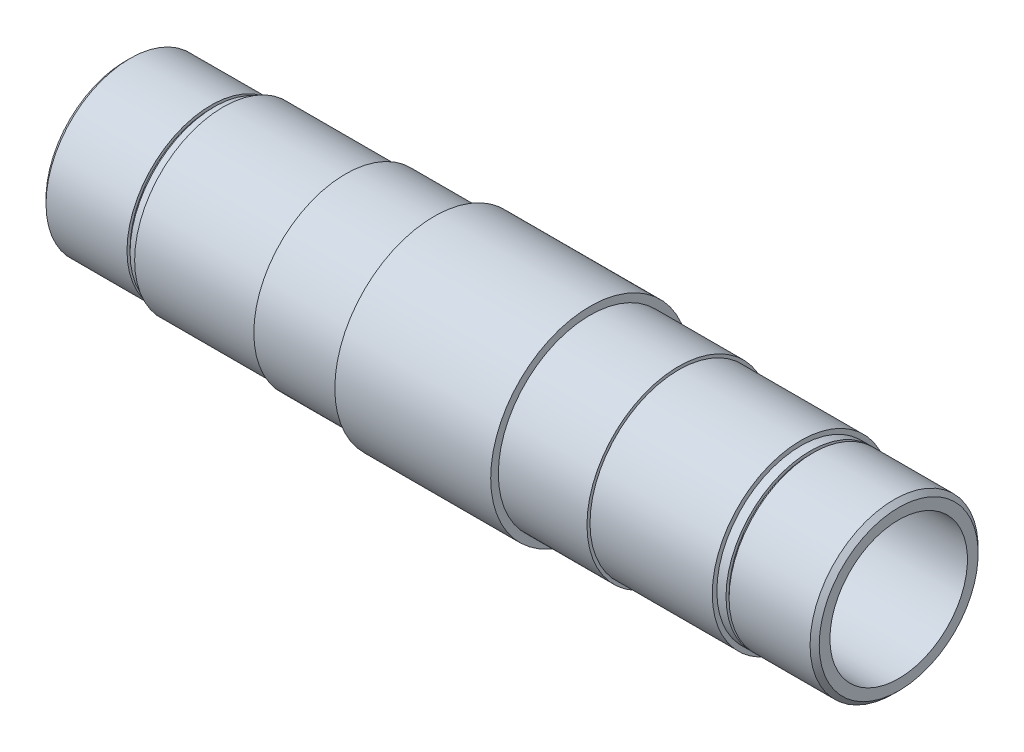
ISO-10303-21;
HEADER;
FILE_DESCRIPTION(('STEP AP214'),'2;1');
FILE_NAME('part.step','',(''),(''),'','','');
FILE_SCHEMA(('AUTOMOTIVE_DESIGN { 1 0 10303 214 1 1 1 1 }'));
ENDSEC;
DATA;
#1=APPLICATION_CONTEXT('core data for automotive mechanical design processes');
#2=APPLICATION_PROTOCOL_DEFINITION('international standard','automotive_design',2000,#1);
#3=PRODUCT_CONTEXT('',#1,'mechanical');
#4=PRODUCT('Part','Part','',(#3));
#5=PRODUCT_RELATED_PRODUCT_CATEGORY('part','',(#4));
#6=PRODUCT_DEFINITION_FORMATION('','',#4);
#7=PRODUCT_DEFINITION_CONTEXT('part definition',#1,'design');
#8=PRODUCT_DEFINITION('design','',#6,#7);
#9=PRODUCT_DEFINITION_SHAPE('','',#8);
#10=(LENGTH_UNIT() NAMED_UNIT(*) SI_UNIT(.MILLI.,.METRE.));
#11=(NAMED_UNIT(*) PLANE_ANGLE_UNIT() SI_UNIT($,.RADIAN.));
#12=(NAMED_UNIT(*) SI_UNIT($,.STERADIAN.) SOLID_ANGLE_UNIT());
#13=UNCERTAINTY_MEASURE_WITH_UNIT(LENGTH_MEASURE(1.E-05),#10,'distance_accuracy_value','');
#14=(GEOMETRIC_REPRESENTATION_CONTEXT(3) GLOBAL_UNCERTAINTY_ASSIGNED_CONTEXT((#13)) GLOBAL_UNIT_ASSIGNED_CONTEXT((#10,
#11,#12)) REPRESENTATION_CONTEXT('',''));
#15=CARTESIAN_POINT('',(0.,0.,0.));
#16=DIRECTION('',(0.,0.,1.));
#17=DIRECTION('',(1.,0.,0.));
#18=AXIS2_PLACEMENT_3D('',#15,#16,#17);
#19=CARTESIAN_POINT('',(0.,0.,0.));
#20=DIRECTION('',(-1.,0.,0.));
#21=DIRECTION('',(0.,0.,1.));
#22=AXIS2_PLACEMENT_3D('',#19,#20,#21);
#23=CYLINDRICAL_SURFACE('',#22,27.5);
#24=CARTESIAN_POINT('',(-97.5,0.,0.));
#25=DIRECTION('',(-1.,0.,0.));
#26=DIRECTION('',(0.,0.,1.));
#27=AXIS2_PLACEMENT_3D('',#24,#25,#26);
#28=CIRCLE('',#27,27.5);
#29=CARTESIAN_POINT('',(-97.5,0.,27.5));
#30=VERTEX_POINT('',#29);
#31=EDGE_CURVE('E94',#30,#30,#28,.T.);
#32=ORIENTED_EDGE('',*,*,#31,.F.);
#33=EDGE_LOOP('',(#32));
#34=FACE_BOUND('',#33,.T.);
#35=CARTESIAN_POINT('',(-94.5,0.,0.));
#36=DIRECTION('',(-1.,0.,0.));
#37=DIRECTION('',(0.,0.,1.));
#38=AXIS2_PLACEMENT_3D('',#35,#36,#37);
#39=CIRCLE('',#38,27.5);
#40=CARTESIAN_POINT('',(-94.5,0.,27.5));
#41=VERTEX_POINT('',#40);
#42=EDGE_CURVE('E64',#41,#41,#39,.T.);
#43=ORIENTED_EDGE('',*,*,#42,.T.);
#44=EDGE_LOOP('',(#43));
#45=FACE_BOUND('',#44,.T.);
#46=ADVANCED_FACE('F44',(#34,#45),#23,.T.);
#47=CARTESIAN_POINT('',(-94.5,29.,0.));
#48=DIRECTION('',(1.,0.,0.));
#49=DIRECTION('',(0.,0.,-1.));
#50=AXIS2_PLACEMENT_3D('',#47,#48,#49);
#51=PLANE('',#50);
#52=ORIENTED_EDGE('',*,*,#42,.F.);
#53=EDGE_LOOP('',(#52));
#54=FACE_BOUND('',#53,.T.);
#55=CARTESIAN_POINT('',(-94.5,0.,0.));
#56=DIRECTION('',(-1.,0.,0.));
#57=DIRECTION('',(0.,0.,1.));
#58=AXIS2_PLACEMENT_3D('',#55,#56,#57);
#59=CIRCLE('',#58,29.);
#60=CARTESIAN_POINT('',(-94.5,0.,29.));
#61=VERTEX_POINT('',#60);
#62=EDGE_CURVE('E67',#61,#61,#59,.T.);
#63=ORIENTED_EDGE('',*,*,#62,.T.);
#64=EDGE_LOOP('',(#63));
#65=FACE_BOUND('',#64,.T.);
#66=ADVANCED_FACE('F148',(#54,#65),#51,.F.);
#67=CARTESIAN_POINT('',(0.,0.,0.));
#68=DIRECTION('',(-1.,0.,0.));
#69=DIRECTION('',(0.,0.,1.));
#70=AXIS2_PLACEMENT_3D('',#67,#68,#69);
#71=CYLINDRICAL_SURFACE('',#70,29.);
#72=ORIENTED_EDGE('',*,*,#62,.F.);
#73=EDGE_LOOP('',(#72));
#74=FACE_BOUND('',#73,.T.);
#75=CARTESIAN_POINT('',(-54.5,0.,0.));
#76=DIRECTION('',(-1.,0.,0.));
#77=DIRECTION('',(0.,0.,1.));
#78=AXIS2_PLACEMENT_3D('',#75,#76,#77);
#79=CIRCLE('',#78,29.);
#80=CARTESIAN_POINT('',(-54.5,0.,29.));
#81=VERTEX_POINT('',#80);
#82=EDGE_CURVE('E70',#81,#81,#79,.T.);
#83=ORIENTED_EDGE('',*,*,#82,.T.);
#84=EDGE_LOOP('',(#83));
#85=FACE_BOUND('',#84,.T.);
#86=ADVANCED_FACE('F154',(#74,#85),#71,.T.);
#87=CARTESIAN_POINT('',(-54.5,30.,0.));
#88=DIRECTION('',(1.,0.,0.));
#89=DIRECTION('',(0.,0.,-1.));
#90=AXIS2_PLACEMENT_3D('',#87,#88,#89);
#91=PLANE('',#90);
#92=ORIENTED_EDGE('',*,*,#82,.F.);
#93=EDGE_LOOP('',(#92));
#94=FACE_BOUND('',#93,.T.);
#95=CARTESIAN_POINT('',(-54.5,0.,0.));
#96=DIRECTION('',(-1.,0.,0.));
#97=DIRECTION('',(0.,0.,1.));
#98=AXIS2_PLACEMENT_3D('',#95,#96,#97);
#99=CIRCLE('',#98,30.);
#100=CARTESIAN_POINT('',(-54.5,0.,30.));
#101=VERTEX_POINT('',#100);
#102=EDGE_CURVE('E73',#101,#101,#99,.T.);
#103=ORIENTED_EDGE('',*,*,#102,.T.);
#104=EDGE_LOOP('',(#103));
#105=FACE_BOUND('',#104,.T.);
#106=ADVANCED_FACE('F162',(#94,#105),#91,.F.);
#107=CARTESIAN_POINT('',(0.,0.,0.));
#108=DIRECTION('',(-1.,0.,0.));
#109=DIRECTION('',(0.,0.,1.));
#110=AXIS2_PLACEMENT_3D('',#107,#108,#109);
#111=CYLINDRICAL_SURFACE('',#110,30.);
#112=ORIENTED_EDGE('',*,*,#102,.F.);
#113=EDGE_LOOP('',(#112));
#114=FACE_BOUND('',#113,.T.);
#115=CARTESIAN_POINT('',(-25.5,0.,0.));
#116=DIRECTION('',(-1.,0.,0.));
#117=DIRECTION('',(0.,0.,1.));
#118=AXIS2_PLACEMENT_3D('',#115,#116,#117);
#119=CIRCLE('',#118,30.);
#120=CARTESIAN_POINT('',(-25.5,0.,30.));
#121=VERTEX_POINT('',#120);
#122=EDGE_CURVE('E76',#121,#121,#119,.T.);
#123=ORIENTED_EDGE('',*,*,#122,.T.);
#124=EDGE_LOOP('',(#123));
#125=FACE_BOUND('',#124,.T.);
#126=ADVANCED_FACE('F166',(#114,#125),#111,.T.);
#127=CARTESIAN_POINT('',(-25.5,32.5,0.));
#128=DIRECTION('',(1.,0.,0.));
#129=DIRECTION('',(0.,0.,-1.));
#130=AXIS2_PLACEMENT_3D('',#127,#128,#129);
#131=PLANE('',#130);
#132=ORIENTED_EDGE('',*,*,#122,.F.);
#133=EDGE_LOOP('',(#132));
#134=FACE_BOUND('',#133,.T.);
#135=CARTESIAN_POINT('',(-25.5,0.,0.));
#136=DIRECTION('',(-1.,0.,0.));
#137=DIRECTION('',(0.,0.,1.));
#138=AXIS2_PLACEMENT_3D('',#135,#136,#137);
#139=CIRCLE('',#138,32.5);
#140=CARTESIAN_POINT('',(-25.5,0.,32.5));
#141=VERTEX_POINT('',#140);
#142=EDGE_CURVE('E79',#141,#141,#139,.T.);
#143=ORIENTED_EDGE('',*,*,#142,.T.);
#144=EDGE_LOOP('',(#143));
#145=FACE_BOUND('',#144,.T.);
#146=ADVANCED_FACE('F170',(#134,#145),#131,.F.);
#147=CARTESIAN_POINT('',(0.,0.,0.));
#148=DIRECTION('',(-1.,0.,0.));
#149=DIRECTION('',(0.,0.,1.));
#150=AXIS2_PLACEMENT_3D('',#147,#148,#149);
#151=CYLINDRICAL_SURFACE('',#150,32.5);
#152=ORIENTED_EDGE('',*,*,#142,.F.);
#153=EDGE_LOOP('',(#152));
#154=FACE_BOUND('',#153,.T.);
#155=CARTESIAN_POINT('',(25.5,0.,0.));
#156=DIRECTION('',(-1.,0.,0.));
#157=DIRECTION('',(0.,0.,1.));
#158=AXIS2_PLACEMENT_3D('',#155,#156,#157);
#159=CIRCLE('',#158,32.5);
#160=CARTESIAN_POINT('',(25.5,0.,32.5));
#161=VERTEX_POINT('',#160);
#162=EDGE_CURVE('E112',#161,#161,#159,.T.);
#163=ORIENTED_EDGE('',*,*,#162,.T.);
#164=EDGE_LOOP('',(#163));
#165=FACE_BOUND('',#164,.T.);
#166=ADVANCED_FACE('F174',(#154,#165),#151,.T.);
#167=CARTESIAN_POINT('',(0.,0.,0.));
#168=DIRECTION('',(-1.,0.,0.));
#169=DIRECTION('',(0.,0.,1.));
#170=AXIS2_PLACEMENT_3D('',#167,#168,#169);
#171=CYLINDRICAL_SURFACE('',#170,22.5);
#172=CARTESIAN_POINT('',(-126.5,0.,0.));
#173=DIRECTION('',(-1.,0.,0.));
#174=DIRECTION('',(0.,0.,1.));
#175=AXIS2_PLACEMENT_3D('',#172,#173,#174);
#176=CIRCLE('',#175,22.5);
#177=CARTESIAN_POINT('',(-126.5,0.,22.5));
#178=VERTEX_POINT('',#177);
#179=EDGE_CURVE('E82',#178,#178,#176,.T.);
#180=ORIENTED_EDGE('',*,*,#179,.T.);
#181=EDGE_LOOP('',(#180));
#182=FACE_BOUND('',#181,.T.);
#183=CARTESIAN_POINT('',(126.5,0.,0.));
#184=DIRECTION('',(-1.,0.,0.));
#185=DIRECTION('',(0.,0.,1.));
#186=AXIS2_PLACEMENT_3D('',#183,#184,#185);
#187=CIRCLE('',#186,22.5);
#188=CARTESIAN_POINT('',(126.5,0.,22.5));
#189=VERTEX_POINT('',#188);
#190=EDGE_CURVE('E115',#189,#189,#187,.T.);
#191=ORIENTED_EDGE('',*,*,#190,.F.);
#192=EDGE_LOOP('',(#191));
#193=FACE_BOUND('',#192,.T.);
#194=ADVANCED_FACE('F178',(#182,#193),#171,.F.);
#195=CARTESIAN_POINT('',(-126.5,27.5,0.));
#196=DIRECTION('',(1.,0.,0.));
#197=DIRECTION('',(0.,0.,-1.));
#198=AXIS2_PLACEMENT_3D('',#195,#196,#197);
#199=PLANE('',#198);
#200=CARTESIAN_POINT('',(-126.5,0.,0.));
#201=DIRECTION('',(1.,0.,0.));
#202=DIRECTION('',(0.,0.,-1.));
#203=AXIS2_PLACEMENT_3D('',#200,#201,#202);
#204=CIRCLE('',#203,26.);
#205=CARTESIAN_POINT('',(-126.5,0.,-26.));
#206=VERTEX_POINT('',#205);
#207=EDGE_CURVE('E51',#206,#206,#204,.F.);
#208=ORIENTED_EDGE('',*,*,#207,.T.);
#209=EDGE_LOOP('',(#208));
#210=FACE_BOUND('',#209,.T.);
#211=ORIENTED_EDGE('',*,*,#179,.F.);
#212=EDGE_LOOP('',(#211));
#213=FACE_BOUND('',#212,.T.);
#214=ADVANCED_FACE('F182',(#210,#213),#199,.F.);
#215=CARTESIAN_POINT('',(0.,0.,0.));
#216=DIRECTION('',(-1.,0.,0.));
#217=DIRECTION('',(0.,0.,1.));
#218=AXIS2_PLACEMENT_3D('',#215,#216,#217);
#219=CYLINDRICAL_SURFACE('',#218,27.5);
#220=CARTESIAN_POINT('',(-125.,0.,0.));
#221=DIRECTION('',(1.,0.,0.));
#222=DIRECTION('',(0.,0.,-1.));
#223=AXIS2_PLACEMENT_3D('',#220,#221,#222);
#224=CIRCLE('',#223,27.5);
#225=CARTESIAN_POINT('',(-125.,0.,-27.5));
#226=VERTEX_POINT('',#225);
#227=EDGE_CURVE('E10',#226,#226,#224,.T.);
#228=ORIENTED_EDGE('',*,*,#227,.T.);
#229=EDGE_LOOP('',(#228));
#230=FACE_BOUND('',#229,.T.);
#231=CARTESIAN_POINT('',(-98.5,0.,0.));
#232=DIRECTION('',(-1.,0.,0.));
#233=DIRECTION('',(0.,0.,1.));
#234=AXIS2_PLACEMENT_3D('',#231,#232,#233);
#235=CIRCLE('',#234,27.5);
#236=CARTESIAN_POINT('',(-98.5,0.,27.5));
#237=VERTEX_POINT('',#236);
#238=EDGE_CURVE('E85',#237,#237,#235,.T.);
#239=ORIENTED_EDGE('',*,*,#238,.T.);
#240=EDGE_LOOP('',(#239));
#241=FACE_BOUND('',#240,.T.);
#242=ADVANCED_FACE('F186',(#230,#241),#219,.T.);
#243=CARTESIAN_POINT('',(-98.5,27.5,0.));
#244=DIRECTION('',(-1.,0.,0.));
#245=DIRECTION('',(0.,0.,1.));
#246=AXIS2_PLACEMENT_3D('',#243,#244,#245);
#247=PLANE('',#246);
#248=ORIENTED_EDGE('',*,*,#238,.F.);
#249=EDGE_LOOP('',(#248));
#250=FACE_BOUND('',#249,.T.);
#251=CARTESIAN_POINT('',(-98.5,0.,0.));
#252=DIRECTION('',(-1.,0.,0.));
#253=DIRECTION('',(0.,0.,1.));
#254=AXIS2_PLACEMENT_3D('',#251,#252,#253);
#255=CIRCLE('',#254,26.5);
#256=CARTESIAN_POINT('',(-98.5,0.,26.5));
#257=VERTEX_POINT('',#256);
#258=EDGE_CURVE('E88',#257,#257,#255,.T.);
#259=ORIENTED_EDGE('',*,*,#258,.T.);
#260=EDGE_LOOP('',(#259));
#261=FACE_BOUND('',#260,.T.);
#262=ADVANCED_FACE('F189',(#250,#261),#247,.F.);
#263=CARTESIAN_POINT('',(0.,0.,0.));
#264=DIRECTION('',(-1.,0.,0.));
#265=DIRECTION('',(0.,0.,1.));
#266=AXIS2_PLACEMENT_3D('',#263,#264,#265);
#267=CYLINDRICAL_SURFACE('',#266,26.5);
#268=ORIENTED_EDGE('',*,*,#258,.F.);
#269=EDGE_LOOP('',(#268));
#270=FACE_BOUND('',#269,.T.);
#271=CARTESIAN_POINT('',(-97.5,0.,0.));
#272=DIRECTION('',(-1.,0.,0.));
#273=DIRECTION('',(0.,0.,1.));
#274=AXIS2_PLACEMENT_3D('',#271,#272,#273);
#275=CIRCLE('',#274,26.5);
#276=CARTESIAN_POINT('',(-97.5,0.,26.5));
#277=VERTEX_POINT('',#276);
#278=EDGE_CURVE('E91',#277,#277,#275,.T.);
#279=ORIENTED_EDGE('',*,*,#278,.T.);
#280=EDGE_LOOP('',(#279));
#281=FACE_BOUND('',#280,.T.);
#282=ADVANCED_FACE('F192',(#270,#281),#267,.T.);
#283=CARTESIAN_POINT('',(-97.5,26.5,0.));
#284=DIRECTION('',(1.,0.,0.));
#285=DIRECTION('',(0.,0.,-1.));
#286=AXIS2_PLACEMENT_3D('',#283,#284,#285);
#287=PLANE('',#286);
#288=ORIENTED_EDGE('',*,*,#278,.F.);
#289=EDGE_LOOP('',(#288));
#290=FACE_BOUND('',#289,.T.);
#291=ORIENTED_EDGE('',*,*,#31,.T.);
#292=EDGE_LOOP('',(#291));
#293=FACE_BOUND('',#292,.T.);
#294=ADVANCED_FACE('F196',(#290,#293),#287,.F.);
#295=CARTESIAN_POINT('',(0.,0.,0.));
#296=DIRECTION('',(1.,0.,0.));
#297=DIRECTION('',(0.,0.,1.));
#298=AXIS2_PLACEMENT_3D('',#295,#296,#297);
#299=CYLINDRICAL_SURFACE('',#298,27.5);
#300=CARTESIAN_POINT('',(97.5,0.,0.));
#301=DIRECTION('',(-1.,0.,0.));
#302=DIRECTION('',(0.,0.,1.));
#303=AXIS2_PLACEMENT_3D('',#300,#301,#302);
#304=CIRCLE('',#303,27.5);
#305=CARTESIAN_POINT('',(97.5,0.,27.5));
#306=VERTEX_POINT('',#305);
#307=EDGE_CURVE('E127',#306,#306,#304,.T.);
#308=ORIENTED_EDGE('',*,*,#307,.T.);
#309=EDGE_LOOP('',(#308));
#310=FACE_BOUND('',#309,.T.);
#311=CARTESIAN_POINT('',(94.5,0.,0.));
#312=DIRECTION('',(-1.,0.,0.));
#313=DIRECTION('',(0.,0.,1.));
#314=AXIS2_PLACEMENT_3D('',#311,#312,#313);
#315=CIRCLE('',#314,27.5);
#316=CARTESIAN_POINT('',(94.5,0.,27.5));
#317=VERTEX_POINT('',#316);
#318=EDGE_CURVE('E97',#317,#317,#315,.T.);
#319=ORIENTED_EDGE('',*,*,#318,.F.);
#320=EDGE_LOOP('',(#319));
#321=FACE_BOUND('',#320,.T.);
#322=ADVANCED_FACE('F131',(#310,#321),#299,.T.);
#323=CARTESIAN_POINT('',(94.5,29.,0.));
#324=DIRECTION('',(-1.,0.,0.));
#325=DIRECTION('',(0.,0.,-1.));
#326=AXIS2_PLACEMENT_3D('',#323,#324,#325);
#327=PLANE('',#326);
#328=ORIENTED_EDGE('',*,*,#318,.T.);
#329=EDGE_LOOP('',(#328));
#330=FACE_BOUND('',#329,.T.);
#331=CARTESIAN_POINT('',(94.5,0.,0.));
#332=DIRECTION('',(-1.,0.,0.));
#333=DIRECTION('',(0.,0.,1.));
#334=AXIS2_PLACEMENT_3D('',#331,#332,#333);
#335=CIRCLE('',#334,29.);
#336=CARTESIAN_POINT('',(94.5,0.,29.));
#337=VERTEX_POINT('',#336);
#338=EDGE_CURVE('E100',#337,#337,#335,.T.);
#339=ORIENTED_EDGE('',*,*,#338,.F.);
#340=EDGE_LOOP('',(#339));
#341=FACE_BOUND('',#340,.T.);
#342=ADVANCED_FACE('F203',(#330,#341),#327,.F.);
#343=CARTESIAN_POINT('',(0.,0.,0.));
#344=DIRECTION('',(1.,0.,0.));
#345=DIRECTION('',(0.,0.,1.));
#346=AXIS2_PLACEMENT_3D('',#343,#344,#345);
#347=CYLINDRICAL_SURFACE('',#346,29.);
#348=ORIENTED_EDGE('',*,*,#338,.T.);
#349=EDGE_LOOP('',(#348));
#350=FACE_BOUND('',#349,.T.);
#351=CARTESIAN_POINT('',(54.5,0.,0.));
#352=DIRECTION('',(-1.,0.,0.));
#353=DIRECTION('',(0.,0.,1.));
#354=AXIS2_PLACEMENT_3D('',#351,#352,#353);
#355=CIRCLE('',#354,29.);
#356=CARTESIAN_POINT('',(54.5,0.,29.));
#357=VERTEX_POINT('',#356);
#358=EDGE_CURVE('E103',#357,#357,#355,.T.);
#359=ORIENTED_EDGE('',*,*,#358,.F.);
#360=EDGE_LOOP('',(#359));
#361=FACE_BOUND('',#360,.T.);
#362=ADVANCED_FACE('F206',(#350,#361),#347,.T.);
#363=CARTESIAN_POINT('',(54.5,30.,0.));
#364=DIRECTION('',(-1.,0.,0.));
#365=DIRECTION('',(0.,0.,-1.));
#366=AXIS2_PLACEMENT_3D('',#363,#364,#365);
#367=PLANE('',#366);
#368=ORIENTED_EDGE('',*,*,#358,.T.);
#369=EDGE_LOOP('',(#368));
#370=FACE_BOUND('',#369,.T.);
#371=CARTESIAN_POINT('',(54.5,0.,0.));
#372=DIRECTION('',(-1.,0.,0.));
#373=DIRECTION('',(0.,0.,1.));
#374=AXIS2_PLACEMENT_3D('',#371,#372,#373);
#375=CIRCLE('',#374,30.);
#376=CARTESIAN_POINT('',(54.5,0.,30.));
#377=VERTEX_POINT('',#376);
#378=EDGE_CURVE('E106',#377,#377,#375,.T.);
#379=ORIENTED_EDGE('',*,*,#378,.F.);
#380=EDGE_LOOP('',(#379));
#381=FACE_BOUND('',#380,.T.);
#382=ADVANCED_FACE('F210',(#370,#381),#367,.F.);
#383=CARTESIAN_POINT('',(0.,0.,0.));
#384=DIRECTION('',(1.,0.,0.));
#385=DIRECTION('',(0.,0.,1.));
#386=AXIS2_PLACEMENT_3D('',#383,#384,#385);
#387=CYLINDRICAL_SURFACE('',#386,30.);
#388=ORIENTED_EDGE('',*,*,#378,.T.);
#389=EDGE_LOOP('',(#388));
#390=FACE_BOUND('',#389,.T.);
#391=CARTESIAN_POINT('',(25.5,0.,0.));
#392=DIRECTION('',(-1.,0.,0.));
#393=DIRECTION('',(0.,0.,1.));
#394=AXIS2_PLACEMENT_3D('',#391,#392,#393);
#395=CIRCLE('',#394,30.);
#396=CARTESIAN_POINT('',(25.5,0.,30.));
#397=VERTEX_POINT('',#396);
#398=EDGE_CURVE('E109',#397,#397,#395,.T.);
#399=ORIENTED_EDGE('',*,*,#398,.F.);
#400=EDGE_LOOP('',(#399));
#401=FACE_BOUND('',#400,.T.);
#402=ADVANCED_FACE('F214',(#390,#401),#387,.T.);
#403=CARTESIAN_POINT('',(25.5,32.5,0.));
#404=DIRECTION('',(-1.,0.,0.));
#405=DIRECTION('',(0.,0.,-1.));
#406=AXIS2_PLACEMENT_3D('',#403,#404,#405);
#407=PLANE('',#406);
#408=ORIENTED_EDGE('',*,*,#398,.T.);
#409=EDGE_LOOP('',(#408));
#410=FACE_BOUND('',#409,.T.);
#411=ORIENTED_EDGE('',*,*,#162,.F.);
#412=EDGE_LOOP('',(#411));
#413=FACE_BOUND('',#412,.T.);
#414=ADVANCED_FACE('F218',(#410,#413),#407,.F.);
#415=CARTESIAN_POINT('',(126.5,27.5,0.));
#416=DIRECTION('',(-1.,0.,0.));
#417=DIRECTION('',(0.,0.,-1.));
#418=AXIS2_PLACEMENT_3D('',#415,#416,#417);
#419=PLANE('',#418);
#420=CARTESIAN_POINT('',(126.5,0.,0.));
#421=DIRECTION('',(-1.,0.,0.));
#422=DIRECTION('',(0.,0.,1.));
#423=AXIS2_PLACEMENT_3D('',#420,#421,#422);
#424=CIRCLE('',#423,26.);
#425=CARTESIAN_POINT('',(126.5,0.,26.));
#426=VERTEX_POINT('',#425);
#427=EDGE_CURVE('E55',#426,#426,#424,.F.);
#428=ORIENTED_EDGE('',*,*,#427,.T.);
#429=EDGE_LOOP('',(#428));
#430=FACE_BOUND('',#429,.T.);
#431=ORIENTED_EDGE('',*,*,#190,.T.);
#432=EDGE_LOOP('',(#431));
#433=FACE_BOUND('',#432,.T.);
#434=ADVANCED_FACE('F222',(#430,#433),#419,.F.);
#435=CARTESIAN_POINT('',(0.,0.,0.));
#436=DIRECTION('',(1.,0.,0.));
#437=DIRECTION('',(0.,0.,1.));
#438=AXIS2_PLACEMENT_3D('',#435,#436,#437);
#439=CYLINDRICAL_SURFACE('',#438,27.5);
#440=CARTESIAN_POINT('',(125.,0.,0.));
#441=DIRECTION('',(-1.,0.,0.));
#442=DIRECTION('',(0.,0.,1.));
#443=AXIS2_PLACEMENT_3D('',#440,#441,#442);
#444=CIRCLE('',#443,27.5);
#445=CARTESIAN_POINT('',(125.,0.,27.5));
#446=VERTEX_POINT('',#445);
#447=EDGE_CURVE('E59',#446,#446,#444,.T.);
#448=ORIENTED_EDGE('',*,*,#447,.T.);
#449=EDGE_LOOP('',(#448));
#450=FACE_BOUND('',#449,.T.);
#451=CARTESIAN_POINT('',(98.5,0.,0.));
#452=DIRECTION('',(-1.,0.,0.));
#453=DIRECTION('',(0.,0.,1.));
#454=AXIS2_PLACEMENT_3D('',#451,#452,#453);
#455=CIRCLE('',#454,27.5);
#456=CARTESIAN_POINT('',(98.5,0.,27.5));
#457=VERTEX_POINT('',#456);
#458=EDGE_CURVE('E118',#457,#457,#455,.T.);
#459=ORIENTED_EDGE('',*,*,#458,.F.);
#460=EDGE_LOOP('',(#459));
#461=FACE_BOUND('',#460,.T.);
#462=ADVANCED_FACE('F226',(#450,#461),#439,.T.);
#463=CARTESIAN_POINT('',(98.5,27.5,0.));
#464=DIRECTION('',(1.,0.,0.));
#465=DIRECTION('',(0.,0.,1.));
#466=AXIS2_PLACEMENT_3D('',#463,#464,#465);
#467=PLANE('',#466);
#468=ORIENTED_EDGE('',*,*,#458,.T.);
#469=EDGE_LOOP('',(#468));
#470=FACE_BOUND('',#469,.T.);
#471=CARTESIAN_POINT('',(98.5,0.,0.));
#472=DIRECTION('',(-1.,0.,0.));
#473=DIRECTION('',(0.,0.,1.));
#474=AXIS2_PLACEMENT_3D('',#471,#472,#473);
#475=CIRCLE('',#474,26.5);
#476=CARTESIAN_POINT('',(98.5,0.,26.5));
#477=VERTEX_POINT('',#476);
#478=EDGE_CURVE('E121',#477,#477,#475,.T.);
#479=ORIENTED_EDGE('',*,*,#478,.F.);
#480=EDGE_LOOP('',(#479));
#481=FACE_BOUND('',#480,.T.);
#482=ADVANCED_FACE('F144',(#470,#481),#467,.F.);
#483=CARTESIAN_POINT('',(0.,0.,0.));
#484=DIRECTION('',(1.,0.,0.));
#485=DIRECTION('',(0.,0.,1.));
#486=AXIS2_PLACEMENT_3D('',#483,#484,#485);
#487=CYLINDRICAL_SURFACE('',#486,26.5);
#488=ORIENTED_EDGE('',*,*,#478,.T.);
#489=EDGE_LOOP('',(#488));
#490=FACE_BOUND('',#489,.T.);
#491=CARTESIAN_POINT('',(97.5,0.,0.));
#492=DIRECTION('',(-1.,0.,0.));
#493=DIRECTION('',(0.,0.,1.));
#494=AXIS2_PLACEMENT_3D('',#491,#492,#493);
#495=CIRCLE('',#494,26.5);
#496=CARTESIAN_POINT('',(97.5,0.,26.5));
#497=VERTEX_POINT('',#496);
#498=EDGE_CURVE('E124',#497,#497,#495,.T.);
#499=ORIENTED_EDGE('',*,*,#498,.F.);
#500=EDGE_LOOP('',(#499));
#501=FACE_BOUND('',#500,.T.);
#502=ADVANCED_FACE('F137',(#490,#501),#487,.T.);
#503=CARTESIAN_POINT('',(97.5,26.5,0.));
#504=DIRECTION('',(-1.,0.,0.));
#505=DIRECTION('',(0.,0.,-1.));
#506=AXIS2_PLACEMENT_3D('',#503,#504,#505);
#507=PLANE('',#506);
#508=ORIENTED_EDGE('',*,*,#498,.T.);
#509=EDGE_LOOP('',(#508));
#510=FACE_BOUND('',#509,.T.);
#511=ORIENTED_EDGE('',*,*,#307,.F.);
#512=EDGE_LOOP('',(#511));
#513=FACE_BOUND('',#512,.T.);
#514=ADVANCED_FACE('F134',(#510,#513),#507,.F.);
#515=CARTESIAN_POINT('',(125.,0.,0.));
#516=DIRECTION('',(-1.,0.,0.));
#517=DIRECTION('',(0.,0.,1.));
#518=AXIS2_PLACEMENT_3D('',#515,#516,#517);
#519=CONICAL_SURFACE('',#518,27.5,0.785398163397434);
#520=ORIENTED_EDGE('',*,*,#427,.F.);
#521=EDGE_LOOP('',(#520));
#522=FACE_BOUND('',#521,.T.);
#523=ORIENTED_EDGE('',*,*,#447,.F.);
#524=EDGE_LOOP('',(#523));
#525=FACE_BOUND('',#524,.T.);
#526=ADVANCED_FACE('F136',(#522,#525),#519,.T.);
#527=CARTESIAN_POINT('',(-126.5,0.,0.));
#528=DIRECTION('',(1.,0.,0.));
#529=DIRECTION('',(0.,0.,-1.));
#530=AXIS2_PLACEMENT_3D('',#527,#528,#529);
#531=CONICAL_SURFACE('',#530,26.,0.785398163397443);
#532=ORIENTED_EDGE('',*,*,#227,.F.);
#533=EDGE_LOOP('',(#532));
#534=FACE_BOUND('',#533,.T.);
#535=ORIENTED_EDGE('',*,*,#207,.F.);
#536=EDGE_LOOP('',(#535));
#537=FACE_BOUND('',#536,.T.);
#538=ADVANCED_FACE('F46',(#534,#537),#531,.T.);
#539=CLOSED_SHELL('',(#46,#66,#86,#106,#126,#146,#166,#194,#214,#242,#262,#282,#294,#322,#342,
#362,#382,#402,#414,#434,#462,#482,#502,#514,#526,#538));
#540=MANIFOLD_SOLID_BREP('B2',#539);
#541=ADVANCED_BREP_SHAPE_REPRESENTATION('',(#18,#540),#14);
#542=SHAPE_DEFINITION_REPRESENTATION(#9,#541);
ENDSEC;
END-ISO-10303-21;
